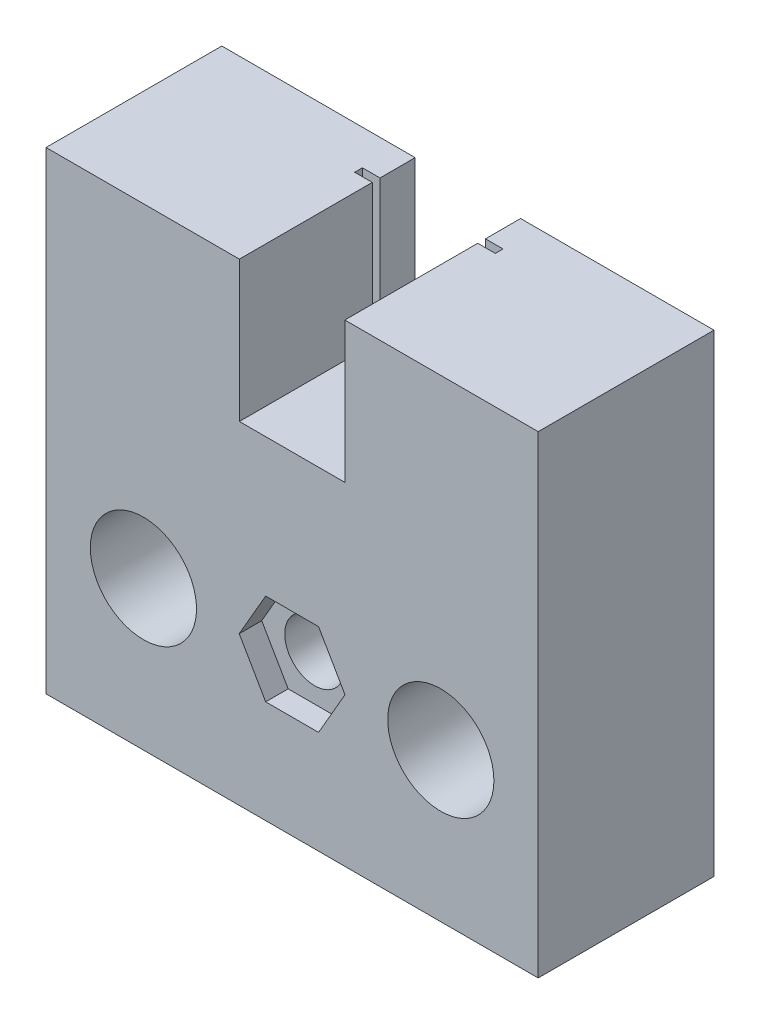
ISO-10303-21;
HEADER;
FILE_DESCRIPTION(('STEP AP214'),'2;1');
FILE_NAME('part.step','',(''),(''),'','','');
FILE_SCHEMA(('AUTOMOTIVE_DESIGN { 1 0 10303 214 1 1 1 1 }'));
ENDSEC;
DATA;
#1=APPLICATION_CONTEXT('core data for automotive mechanical design processes');
#2=APPLICATION_PROTOCOL_DEFINITION('international standard','automotive_design',2000,#1);
#3=PRODUCT_CONTEXT('',#1,'mechanical');
#4=PRODUCT('Part','Part','',(#3));
#5=PRODUCT_RELATED_PRODUCT_CATEGORY('part','',(#4));
#6=PRODUCT_DEFINITION_FORMATION('','',#4);
#7=PRODUCT_DEFINITION_CONTEXT('part definition',#1,'design');
#8=PRODUCT_DEFINITION('design','',#6,#7);
#9=PRODUCT_DEFINITION_SHAPE('','',#8);
#10=(LENGTH_UNIT() NAMED_UNIT(*) SI_UNIT(.MILLI.,.METRE.));
#11=(NAMED_UNIT(*) PLANE_ANGLE_UNIT() SI_UNIT($,.RADIAN.));
#12=(NAMED_UNIT(*) SI_UNIT($,.STERADIAN.) SOLID_ANGLE_UNIT());
#13=UNCERTAINTY_MEASURE_WITH_UNIT(LENGTH_MEASURE(1.E-05),#10,'distance_accuracy_value','');
#14=(GEOMETRIC_REPRESENTATION_CONTEXT(3) GLOBAL_UNCERTAINTY_ASSIGNED_CONTEXT((#13)) GLOBAL_UNIT_ASSIGNED_CONTEXT((#10,
#11,#12)) REPRESENTATION_CONTEXT('',''));
#15=CARTESIAN_POINT('',(0.,0.,0.));
#16=DIRECTION('',(0.,0.,1.));
#17=DIRECTION('',(1.,0.,0.));
#18=AXIS2_PLACEMENT_3D('',#15,#16,#17);
#19=CARTESIAN_POINT('',(-3.84331797235023,42.2534562211981,25.));
#20=DIRECTION('',(0.,-1.,0.));
#21=DIRECTION('',(0.,0.,-1.));
#22=AXIS2_PLACEMENT_3D('',#19,#20,#21);
#23=PLANE('',#22);
#24=DIRECTION('',(-1.,0.,0.));
#25=VECTOR('',#24,1.);
#26=CARTESIAN_POINT('',(-3.84331797235023,42.2534562211981,0.));
#27=LINE('',#26,#25);
#28=CARTESIAN_POINT('',(31.1566820276498,42.2534562211981,0.));
#29=VERTEX_POINT('',#28);
#30=CARTESIAN_POINT('',(3.65668202764977,42.2534562211981,0.));
#31=VERTEX_POINT('',#30);
#32=EDGE_CURVE('E385',#29,#31,#27,.T.);
#33=ORIENTED_EDGE('',*,*,#32,.T.);
#34=DIRECTION('',(0.,0.,-1.));
#35=VECTOR('',#34,1.);
#36=CARTESIAN_POINT('',(3.65668202764977,42.2534562211981,0.));
#37=LINE('',#36,#35);
#38=CARTESIAN_POINT('',(3.65668202764977,42.2534562211981,5.));
#39=VERTEX_POINT('',#38);
#40=EDGE_CURVE('E243',#39,#31,#37,.T.);
#41=ORIENTED_EDGE('',*,*,#40,.F.);
#42=DIRECTION('',(-1.,0.,0.));
#43=VECTOR('',#42,1.);
#44=CARTESIAN_POINT('',(3.65668202764977,42.2534562211981,5.));
#45=LINE('',#44,#43);
#46=CARTESIAN_POINT('',(6.15668202764977,42.2534562211981,5.));
#47=VERTEX_POINT('',#46);
#48=EDGE_CURVE('E450',#47,#39,#45,.T.);
#49=ORIENTED_EDGE('',*,*,#48,.F.);
#50=DIRECTION('',(0.,0.,-1.));
#51=VECTOR('',#50,1.);
#52=CARTESIAN_POINT('',(6.15668202764977,42.2534562211981,5.));
#53=LINE('',#52,#51);
#54=CARTESIAN_POINT('',(6.15668202764977,42.2534562211981,6.1));
#55=VERTEX_POINT('',#54);
#56=EDGE_CURVE('E447',#55,#47,#53,.T.);
#57=ORIENTED_EDGE('',*,*,#56,.F.);
#58=DIRECTION('',(1.,0.,0.));
#59=VECTOR('',#58,1.);
#60=CARTESIAN_POINT('',(6.15668202764977,42.2534562211981,6.1));
#61=LINE('',#60,#59);
#62=CARTESIAN_POINT('',(3.65668202764977,42.2534562211981,6.1));
#63=VERTEX_POINT('',#62);
#64=EDGE_CURVE('E444',#63,#55,#61,.T.);
#65=ORIENTED_EDGE('',*,*,#64,.F.);
#66=DIRECTION('',(0.,0.,-1.));
#67=VECTOR('',#66,1.);
#68=CARTESIAN_POINT('',(3.65668202764977,42.2534562211981,6.1));
#69=LINE('',#68,#67);
#70=CARTESIAN_POINT('',(3.65668202764978,42.2534562211981,25.));
#71=VERTEX_POINT('',#70);
#72=EDGE_CURVE('E413',#71,#63,#69,.T.);
#73=ORIENTED_EDGE('',*,*,#72,.F.);
#74=DIRECTION('',(-1.,0.,0.));
#75=VECTOR('',#74,1.);
#76=CARTESIAN_POINT('',(-3.84331797235023,42.2534562211981,25.));
#77=LINE('',#76,#75);
#78=CARTESIAN_POINT('',(31.1566820276498,42.2534562211981,25.));
#79=VERTEX_POINT('',#78);
#80=EDGE_CURVE('E367',#79,#71,#77,.T.);
#81=ORIENTED_EDGE('',*,*,#80,.F.);
#82=DIRECTION('',(0.,0.,-1.));
#83=VECTOR('',#82,1.);
#84=CARTESIAN_POINT('',(31.1566820276498,42.2534562211981,25.));
#85=LINE('',#84,#83);
#86=EDGE_CURVE('E378',#79,#29,#85,.T.);
#87=ORIENTED_EDGE('',*,*,#86,.T.);
#88=EDGE_LOOP('',(#33,#41,#49,#57,#65,#73,#81,#87));
#89=FACE_BOUND('',#88,.T.);
#90=ADVANCED_FACE('F40',(#89),#23,.F.);
#91=CARTESIAN_POINT('',(-38.8433179723502,42.2534562211981,25.));
#92=DIRECTION('',(1.,0.,0.));
#93=DIRECTION('',(0.,1.,0.));
#94=AXIS2_PLACEMENT_3D('',#91,#92,#93);
#95=PLANE('',#94);
#96=DIRECTION('',(0.,-1.,0.));
#97=VECTOR('',#96,1.);
#98=CARTESIAN_POINT('',(-38.8433179723502,42.2534562211981,0.));
#99=LINE('',#98,#97);
#100=CARTESIAN_POINT('',(-38.8433179723502,42.2534562211981,0.));
#101=VERTEX_POINT('',#100);
#102=CARTESIAN_POINT('',(-38.8433179723502,-25.0465437788018,0.));
#103=VERTEX_POINT('',#102);
#104=EDGE_CURVE('E356',#101,#103,#99,.T.);
#105=ORIENTED_EDGE('',*,*,#104,.T.);
#106=DIRECTION('',(0.,0.,-1.));
#107=VECTOR('',#106,1.);
#108=CARTESIAN_POINT('',(-38.8433179723502,-25.0465437788018,25.));
#109=LINE('',#108,#107);
#110=CARTESIAN_POINT('',(-38.8433179723502,-25.0465437788018,25.));
#111=VERTEX_POINT('',#110);
#112=EDGE_CURVE('E49',#111,#103,#109,.T.);
#113=ORIENTED_EDGE('',*,*,#112,.F.);
#114=DIRECTION('',(0.,-1.,0.));
#115=VECTOR('',#114,1.);
#116=CARTESIAN_POINT('',(-38.8433179723502,42.2534562211981,25.));
#117=LINE('',#116,#115);
#118=CARTESIAN_POINT('',(-38.8433179723502,42.2534562211981,25.));
#119=VERTEX_POINT('',#118);
#120=EDGE_CURVE('E370',#119,#111,#117,.T.);
#121=ORIENTED_EDGE('',*,*,#120,.F.);
#122=DIRECTION('',(0.,0.,-1.));
#123=VECTOR('',#122,1.);
#124=CARTESIAN_POINT('',(-38.8433179723502,42.2534562211981,25.));
#125=LINE('',#124,#123);
#126=EDGE_CURVE('E11',#119,#101,#125,.T.);
#127=ORIENTED_EDGE('',*,*,#126,.T.);
#128=EDGE_LOOP('',(#105,#113,#121,#127));
#129=FACE_BOUND('',#128,.T.);
#130=ADVANCED_FACE('F42',(#129),#95,.F.);
#131=CARTESIAN_POINT('',(31.1566820276498,-25.0465437788018,25.));
#132=DIRECTION('',(0.,1.,0.));
#133=DIRECTION('',(0.,0.,1.));
#134=AXIS2_PLACEMENT_3D('',#131,#132,#133);
#135=PLANE('',#134);
#136=DIRECTION('',(1.,0.,0.));
#137=VECTOR('',#136,1.);
#138=CARTESIAN_POINT('',(31.1566820276498,-25.0465437788018,0.));
#139=LINE('',#138,#137);
#140=CARTESIAN_POINT('',(31.1566820276498,-25.0465437788018,0.));
#141=VERTEX_POINT('',#140);
#142=EDGE_CURVE('E381',#103,#141,#139,.T.);
#143=ORIENTED_EDGE('',*,*,#142,.T.);
#144=DIRECTION('',(0.,0.,-1.));
#145=VECTOR('',#144,1.);
#146=CARTESIAN_POINT('',(31.1566820276498,-25.0465437788018,25.));
#147=LINE('',#146,#145);
#148=CARTESIAN_POINT('',(31.1566820276498,-25.0465437788018,25.));
#149=VERTEX_POINT('',#148);
#150=EDGE_CURVE('E390',#149,#141,#147,.T.);
#151=ORIENTED_EDGE('',*,*,#150,.F.);
#152=DIRECTION('',(1.,0.,0.));
#153=VECTOR('',#152,1.);
#154=CARTESIAN_POINT('',(-38.8433179723502,-25.0465437788018,25.));
#155=LINE('',#154,#153);
#156=EDGE_CURVE('E373',#111,#149,#155,.T.);
#157=ORIENTED_EDGE('',*,*,#156,.F.);
#158=ORIENTED_EDGE('',*,*,#112,.T.);
#159=EDGE_LOOP('',(#143,#151,#157,#158));
#160=FACE_BOUND('',#159,.T.);
#161=ADVANCED_FACE('F397',(#160),#135,.F.);
#162=CARTESIAN_POINT('',(31.1566820276498,42.2534562211981,25.));
#163=DIRECTION('',(-1.,0.,0.));
#164=DIRECTION('',(0.,-1.,0.));
#165=AXIS2_PLACEMENT_3D('',#162,#163,#164);
#166=PLANE('',#165);
#167=DIRECTION('',(0.,1.,0.));
#168=VECTOR('',#167,1.);
#169=CARTESIAN_POINT('',(31.1566820276498,42.2534562211981,0.));
#170=LINE('',#169,#168);
#171=EDGE_CURVE('E383',#141,#29,#170,.T.);
#172=ORIENTED_EDGE('',*,*,#171,.T.);
#173=ORIENTED_EDGE('',*,*,#86,.F.);
#174=DIRECTION('',(0.,1.,0.));
#175=VECTOR('',#174,1.);
#176=CARTESIAN_POINT('',(31.1566820276498,42.2534562211981,25.));
#177=LINE('',#176,#175);
#178=EDGE_CURVE('E375',#149,#79,#177,.T.);
#179=ORIENTED_EDGE('',*,*,#178,.F.);
#180=ORIENTED_EDGE('',*,*,#150,.T.);
#181=EDGE_LOOP('',(#172,#173,#179,#180));
#182=FACE_BOUND('',#181,.T.);
#183=ADVANCED_FACE('F406',(#182),#166,.F.);
#184=CARTESIAN_POINT('',(-11.3433179723502,42.2534562211981,25.));
#185=VERTEX_POINT('',#184);
#186=EDGE_CURVE('E371',#185,#119,#77,.T.);
#187=ORIENTED_EDGE('',*,*,#186,.F.);
#188=DIRECTION('',(0.,0.,1.));
#189=VECTOR('',#188,1.);
#190=CARTESIAN_POINT('',(-11.3433179723502,42.2534562211981,6.1));
#191=LINE('',#190,#189);
#192=CARTESIAN_POINT('',(-11.3433179723502,42.2534562211981,6.1));
#193=VERTEX_POINT('',#192);
#194=EDGE_CURVE('E426',#193,#185,#191,.T.);
#195=ORIENTED_EDGE('',*,*,#194,.F.);
#196=DIRECTION('',(1.,0.,0.));
#197=VECTOR('',#196,1.);
#198=CARTESIAN_POINT('',(-13.8433179723502,42.2534562211981,6.1));
#199=LINE('',#198,#197);
#200=CARTESIAN_POINT('',(-13.8433179723502,42.2534562211981,6.1));
#201=VERTEX_POINT('',#200);
#202=EDGE_CURVE('E439',#201,#193,#199,.T.);
#203=ORIENTED_EDGE('',*,*,#202,.F.);
#204=DIRECTION('',(0.,0.,1.));
#205=VECTOR('',#204,1.);
#206=CARTESIAN_POINT('',(-13.8433179723502,42.2534562211981,5.));
#207=LINE('',#206,#205);
#208=CARTESIAN_POINT('',(-13.8433179723502,42.2534562211981,5.));
#209=VERTEX_POINT('',#208);
#210=EDGE_CURVE('E433',#209,#201,#207,.T.);
#211=ORIENTED_EDGE('',*,*,#210,.F.);
#212=DIRECTION('',(-1.,0.,0.));
#213=VECTOR('',#212,1.);
#214=CARTESIAN_POINT('',(-11.3433179723502,42.2534562211981,5.));
#215=LINE('',#214,#213);
#216=CARTESIAN_POINT('',(-11.3433179723502,42.2534562211981,5.));
#217=VERTEX_POINT('',#216);
#218=EDGE_CURVE('E431',#217,#209,#215,.T.);
#219=ORIENTED_EDGE('',*,*,#218,.F.);
#220=DIRECTION('',(0.,0.,1.));
#221=VECTOR('',#220,1.);
#222=CARTESIAN_POINT('',(-11.3433179723502,42.2534562211981,0.));
#223=LINE('',#222,#221);
#224=CARTESIAN_POINT('',(-11.3433179723502,42.2534562211981,0.));
#225=VERTEX_POINT('',#224);
#226=EDGE_CURVE('E428',#225,#217,#223,.T.);
#227=ORIENTED_EDGE('',*,*,#226,.F.);
#228=EDGE_CURVE('E248',#225,#101,#27,.T.);
#229=ORIENTED_EDGE('',*,*,#228,.T.);
#230=ORIENTED_EDGE('',*,*,#126,.F.);
#231=EDGE_LOOP('',(#187,#195,#203,#211,#219,#227,#229,#230));
#232=FACE_BOUND('',#231,.T.);
#233=ADVANCED_FACE('F424',(#232),#23,.F.);
#234=CARTESIAN_POINT('',(0.,0.,25.));
#235=DIRECTION('',(0.,0.,1.));
#236=DIRECTION('',(1.,0.,0.));
#237=AXIS2_PLACEMENT_3D('',#234,#235,#236);
#238=PLANE('',#237);
#239=DIRECTION('',(0.,1.,0.));
#240=VECTOR('',#239,1.);
#241=CARTESIAN_POINT('',(3.65668202764978,22.2534562211982,25.));
#242=LINE('',#241,#240);
#243=CARTESIAN_POINT('',(3.65668202764978,22.2534562211982,25.));
#244=VERTEX_POINT('',#243);
#245=EDGE_CURVE('E463',#244,#71,#242,.T.);
#246=ORIENTED_EDGE('',*,*,#245,.F.);
#247=DIRECTION('',(1.,0.,0.));
#248=VECTOR('',#247,1.);
#249=CARTESIAN_POINT('',(3.65668202764978,22.2534562211982,25.));
#250=LINE('',#249,#248);
#251=CARTESIAN_POINT('',(-11.3433179723502,22.2534562211982,25.));
#252=VERTEX_POINT('',#251);
#253=EDGE_CURVE('E489',#252,#244,#250,.T.);
#254=ORIENTED_EDGE('',*,*,#253,.F.);
#255=DIRECTION('',(0.,1.,0.));
#256=VECTOR('',#255,1.);
#257=CARTESIAN_POINT('',(-11.3433179723502,22.2534562211982,25.));
#258=LINE('',#257,#256);
#259=EDGE_CURVE('E421',#252,#185,#258,.T.);
#260=ORIENTED_EDGE('',*,*,#259,.T.);
#261=ORIENTED_EDGE('',*,*,#186,.T.);
#262=ORIENTED_EDGE('',*,*,#120,.T.);
#263=ORIENTED_EDGE('',*,*,#156,.T.);
#264=ORIENTED_EDGE('',*,*,#178,.T.);
#265=ORIENTED_EDGE('',*,*,#80,.T.);
#266=EDGE_LOOP('',(#246,#254,#260,#261,#262,#263,#264,#265));
#267=FACE_BOUND('',#266,.T.);
#268=CARTESIAN_POINT('',(17.3066820276498,-3.89654377880185,25.));
#269=DIRECTION('',(0.,0.,1.));
#270=DIRECTION('',(1.,0.,0.));
#271=AXIS2_PLACEMENT_3D('',#268,#269,#270);
#272=CIRCLE('',#271,7.55);
#273=CARTESIAN_POINT('',(24.8566820276498,-3.89654377880185,25.));
#274=VERTEX_POINT('',#273);
#275=EDGE_CURVE('E259',#274,#274,#272,.T.);
#276=ORIENTED_EDGE('',*,*,#275,.F.);
#277=EDGE_LOOP('',(#276));
#278=FACE_BOUND('',#277,.T.);
#279=CARTESIAN_POINT('',(-24.9933179723502,-3.89654377880185,25.));
#280=DIRECTION('',(0.,0.,1.));
#281=DIRECTION('',(-1.,0.,0.));
#282=AXIS2_PLACEMENT_3D('',#279,#280,#281);
#283=CIRCLE('',#282,7.55);
#284=CARTESIAN_POINT('',(-32.5433179723502,-3.89654377880185,25.));
#285=VERTEX_POINT('',#284);
#286=EDGE_CURVE('E262',#285,#285,#283,.T.);
#287=ORIENTED_EDGE('',*,*,#286,.F.);
#288=EDGE_LOOP('',(#287));
#289=FACE_BOUND('',#288,.T.);
#290=DIRECTION('',(0.5,0.866025403784439,0.));
#291=VECTOR('',#290,1.);
#292=CARTESIAN_POINT('',(-0.08188096857981,-10.4115437788018,25.));
#293=LINE('',#292,#291);
#294=CARTESIAN_POINT('',(-0.08188096857981,-10.4115437788018,25.));
#295=VERTEX_POINT('',#294);
#296=CARTESIAN_POINT('',(3.6795560351906,-3.89654377880184,25.));
#297=VERTEX_POINT('',#296);
#298=EDGE_CURVE('E309',#295,#297,#293,.T.);
#299=ORIENTED_EDGE('',*,*,#298,.F.);
#300=DIRECTION('',(1.,0.,0.));
#301=VECTOR('',#300,1.);
#302=CARTESIAN_POINT('',(-7.60475497612064,-10.4115437788018,25.));
#303=LINE('',#302,#301);
#304=CARTESIAN_POINT('',(-7.60475497612064,-10.4115437788018,25.));
#305=VERTEX_POINT('',#304);
#306=EDGE_CURVE('E323',#305,#295,#303,.T.);
#307=ORIENTED_EDGE('',*,*,#306,.F.);
#308=DIRECTION('',(0.5,-0.866025403784439,0.));
#309=VECTOR('',#308,1.);
#310=CARTESIAN_POINT('',(-11.366191979891,-3.89654377880185,25.));
#311=LINE('',#310,#309);
#312=CARTESIAN_POINT('',(-11.366191979891,-3.89654377880185,25.));
#313=VERTEX_POINT('',#312);
#314=EDGE_CURVE('E349',#313,#305,#311,.T.);
#315=ORIENTED_EDGE('',*,*,#314,.F.);
#316=DIRECTION('',(-0.5,-0.866025403784439,0.));
#317=VECTOR('',#316,1.);
#318=CARTESIAN_POINT('',(-7.60475497612063,2.61845622119815,25.));
#319=LINE('',#318,#317);
#320=CARTESIAN_POINT('',(-7.60475497612063,2.61845622119815,25.));
#321=VERTEX_POINT('',#320);
#322=EDGE_CURVE('E346',#321,#313,#319,.T.);
#323=ORIENTED_EDGE('',*,*,#322,.F.);
#324=DIRECTION('',(-1.,0.,0.));
#325=VECTOR('',#324,1.);
#326=CARTESIAN_POINT('',(-0.0818809685798115,2.61845622119815,25.));
#327=LINE('',#326,#325);
#328=CARTESIAN_POINT('',(-0.0818809685798115,2.61845622119815,25.));
#329=VERTEX_POINT('',#328);
#330=EDGE_CURVE('E343',#329,#321,#327,.T.);
#331=ORIENTED_EDGE('',*,*,#330,.F.);
#332=DIRECTION('',(-0.5,0.866025403784439,0.));
#333=VECTOR('',#332,1.);
#334=CARTESIAN_POINT('',(3.6795560351906,-3.89654377880184,25.));
#335=LINE('',#334,#333);
#336=EDGE_CURVE('E340',#297,#329,#335,.T.);
#337=ORIENTED_EDGE('',*,*,#336,.F.);
#338=EDGE_LOOP('',(#299,#307,#315,#323,#331,#337));
#339=FACE_BOUND('',#338,.T.);
#340=ADVANCED_FACE('F416',(#267,#278,#289,#339),#238,.T.);
#341=CARTESIAN_POINT('',(0.,0.,0.));
#342=DIRECTION('',(0.,0.,1.));
#343=DIRECTION('',(1.,0.,0.));
#344=AXIS2_PLACEMENT_3D('',#341,#342,#343);
#345=PLANE('',#344);
#346=CARTESIAN_POINT('',(17.3066820276498,-3.89654377880185,0.));
#347=DIRECTION('',(0.,0.,1.));
#348=DIRECTION('',(1.,0.,0.));
#349=AXIS2_PLACEMENT_3D('',#346,#347,#348);
#350=CIRCLE('',#349,7.55);
#351=CARTESIAN_POINT('',(24.8566820276498,-3.89654377880185,0.));
#352=VERTEX_POINT('',#351);
#353=EDGE_CURVE('E256',#352,#352,#350,.T.);
#354=ORIENTED_EDGE('',*,*,#353,.T.);
#355=EDGE_LOOP('',(#354));
#356=FACE_BOUND('',#355,.T.);
#357=CARTESIAN_POINT('',(-24.9933179723502,-3.89654377880185,0.));
#358=DIRECTION('',(0.,0.,1.));
#359=DIRECTION('',(-1.,0.,0.));
#360=AXIS2_PLACEMENT_3D('',#357,#358,#359);
#361=CIRCLE('',#360,7.55);
#362=CARTESIAN_POINT('',(-32.5433179723502,-3.89654377880185,0.));
#363=VERTEX_POINT('',#362);
#364=EDGE_CURVE('E265',#363,#363,#361,.T.);
#365=ORIENTED_EDGE('',*,*,#364,.T.);
#366=EDGE_LOOP('',(#365));
#367=FACE_BOUND('',#366,.T.);
#368=DIRECTION('',(0.5,0.866025403784438,0.));
#369=VECTOR('',#368,1.);
#370=CARTESIAN_POINT('',(-11.366191979891,-3.89654377880184,0.));
#371=LINE('',#370,#369);
#372=CARTESIAN_POINT('',(-11.366191979891,-3.89654377880184,0.));
#373=VERTEX_POINT('',#372);
#374=CARTESIAN_POINT('',(-7.60475497612063,2.61845622119816,0.));
#375=VERTEX_POINT('',#374);
#376=EDGE_CURVE('E293',#373,#375,#371,.T.);
#377=ORIENTED_EDGE('',*,*,#376,.F.);
#378=DIRECTION('',(-0.5,0.866025403784439,0.));
#379=VECTOR('',#378,1.);
#380=CARTESIAN_POINT('',(-7.60475497612064,-10.4115437788018,0.));
#381=LINE('',#380,#379);
#382=CARTESIAN_POINT('',(-7.60475497612064,-10.4115437788018,0.));
#383=VERTEX_POINT('',#382);
#384=EDGE_CURVE('E64',#383,#373,#381,.T.);
#385=ORIENTED_EDGE('',*,*,#384,.F.);
#386=DIRECTION('',(-1.,0.,0.));
#387=VECTOR('',#386,1.);
#388=CARTESIAN_POINT('',(-0.0818809685798113,-10.4115437788018,0.));
#389=LINE('',#388,#387);
#390=CARTESIAN_POINT('',(-0.0818809685798113,-10.4115437788018,0.));
#391=VERTEX_POINT('',#390);
#392=EDGE_CURVE('E276',#391,#383,#389,.T.);
#393=ORIENTED_EDGE('',*,*,#392,.F.);
#394=DIRECTION('',(-0.5,-0.866025403784439,0.));
#395=VECTOR('',#394,1.);
#396=CARTESIAN_POINT('',(3.6795560351906,-3.89654377880185,0.));
#397=LINE('',#396,#395);
#398=CARTESIAN_POINT('',(3.6795560351906,-3.89654377880185,0.));
#399=VERTEX_POINT('',#398);
#400=EDGE_CURVE('E302',#399,#391,#397,.T.);
#401=ORIENTED_EDGE('',*,*,#400,.F.);
#402=DIRECTION('',(0.5,-0.866025403784439,0.));
#403=VECTOR('',#402,1.);
#404=CARTESIAN_POINT('',(-0.0818809685798122,2.61845622119816,0.));
#405=LINE('',#404,#403);
#406=CARTESIAN_POINT('',(-0.0818809685798122,2.61845622119816,0.));
#407=VERTEX_POINT('',#406);
#408=EDGE_CURVE('E299',#407,#399,#405,.T.);
#409=ORIENTED_EDGE('',*,*,#408,.F.);
#410=DIRECTION('',(1.,0.,0.));
#411=VECTOR('',#410,1.);
#412=CARTESIAN_POINT('',(-7.60475497612063,2.61845622119816,0.));
#413=LINE('',#412,#411);
#414=EDGE_CURVE('E296',#375,#407,#413,.T.);
#415=ORIENTED_EDGE('',*,*,#414,.F.);
#416=EDGE_LOOP('',(#377,#385,#393,#401,#409,#415));
#417=FACE_BOUND('',#416,.T.);
#418=DIRECTION('',(-1.,0.,0.));
#419=VECTOR('',#418,1.);
#420=CARTESIAN_POINT('',(-3.84331797235023,22.2534562211982,0.));
#421=LINE('',#420,#419);
#422=CARTESIAN_POINT('',(3.65668202764977,22.2534562211982,0.));
#423=VERTEX_POINT('',#422);
#424=CARTESIAN_POINT('',(-11.3433179723502,22.2534562211982,0.));
#425=VERTEX_POINT('',#424);
#426=EDGE_CURVE('E237',#423,#425,#421,.T.);
#427=ORIENTED_EDGE('',*,*,#426,.F.);
#428=DIRECTION('',(0.,1.,0.));
#429=VECTOR('',#428,1.);
#430=CARTESIAN_POINT('',(3.65668202764977,22.2534562211982,0.));
#431=LINE('',#430,#429);
#432=EDGE_CURVE('E268',#423,#31,#431,.T.);
#433=ORIENTED_EDGE('',*,*,#432,.T.);
#434=ORIENTED_EDGE('',*,*,#32,.F.);
#435=ORIENTED_EDGE('',*,*,#171,.F.);
#436=ORIENTED_EDGE('',*,*,#142,.F.);
#437=ORIENTED_EDGE('',*,*,#104,.F.);
#438=ORIENTED_EDGE('',*,*,#228,.F.);
#439=DIRECTION('',(0.,1.,0.));
#440=VECTOR('',#439,1.);
#441=CARTESIAN_POINT('',(-11.3433179723502,22.2534562211982,0.));
#442=LINE('',#441,#440);
#443=EDGE_CURVE('E231',#425,#225,#442,.T.);
#444=ORIENTED_EDGE('',*,*,#443,.F.);
#445=EDGE_LOOP('',(#427,#433,#434,#435,#436,#437,#438,#444));
#446=FACE_BOUND('',#445,.T.);
#447=ADVANCED_FACE('F246',(#356,#367,#417,#446),#345,.F.);
#448=CARTESIAN_POINT('',(-0.08188096857981,-10.4115437788018,21.8));
#449=DIRECTION('',(0.866025403784439,-0.5,0.));
#450=DIRECTION('',(0.5,0.866025403784439,0.));
#451=AXIS2_PLACEMENT_3D('',#448,#449,#450);
#452=PLANE('',#451);
#453=ORIENTED_EDGE('',*,*,#298,.T.);
#454=DIRECTION('',(0.,0.,1.));
#455=VECTOR('',#454,1.);
#456=CARTESIAN_POINT('',(3.6795560351906,-3.89654377880184,21.8));
#457=LINE('',#456,#455);
#458=CARTESIAN_POINT('',(3.6795560351906,-3.89654377880184,21.8));
#459=VERTEX_POINT('',#458);
#460=EDGE_CURVE('E338',#459,#297,#457,.T.);
#461=ORIENTED_EDGE('',*,*,#460,.F.);
#462=DIRECTION('',(0.5,0.866025403784439,0.));
#463=VECTOR('',#462,1.);
#464=CARTESIAN_POINT('',(-0.08188096857981,-10.4115437788018,21.8));
#465=LINE('',#464,#463);
#466=CARTESIAN_POINT('',(-0.08188096857981,-10.4115437788018,21.8));
#467=VERTEX_POINT('',#466);
#468=EDGE_CURVE('E319',#467,#459,#465,.T.);
#469=ORIENTED_EDGE('',*,*,#468,.F.);
#470=DIRECTION('',(0.,0.,1.));
#471=VECTOR('',#470,1.);
#472=CARTESIAN_POINT('',(-0.08188096857981,-10.4115437788018,21.8));
#473=LINE('',#472,#471);
#474=EDGE_CURVE('E354',#467,#295,#473,.T.);
#475=ORIENTED_EDGE('',*,*,#474,.T.);
#476=EDGE_LOOP('',(#453,#461,#469,#475));
#477=FACE_BOUND('',#476,.T.);
#478=ADVANCED_FACE('F586',(#477),#452,.F.);
#479=CARTESIAN_POINT('',(-7.60475497612064,-10.4115437788018,21.8));
#480=DIRECTION('',(0.,-1.,0.));
#481=DIRECTION('',(1.,0.,0.));
#482=AXIS2_PLACEMENT_3D('',#479,#480,#481);
#483=PLANE('',#482);
#484=ORIENTED_EDGE('',*,*,#306,.T.);
#485=ORIENTED_EDGE('',*,*,#474,.F.);
#486=DIRECTION('',(1.,0.,0.));
#487=VECTOR('',#486,1.);
#488=CARTESIAN_POINT('',(-7.60475497612064,-10.4115437788018,21.8));
#489=LINE('',#488,#487);
#490=CARTESIAN_POINT('',(-7.60475497612064,-10.4115437788018,21.8));
#491=VERTEX_POINT('',#490);
#492=EDGE_CURVE('E335',#491,#467,#489,.T.);
#493=ORIENTED_EDGE('',*,*,#492,.F.);
#494=DIRECTION('',(0.,0.,1.));
#495=VECTOR('',#494,1.);
#496=CARTESIAN_POINT('',(-7.60475497612064,-10.4115437788018,21.8));
#497=LINE('',#496,#495);
#498=EDGE_CURVE('E357',#491,#305,#497,.T.);
#499=ORIENTED_EDGE('',*,*,#498,.T.);
#500=EDGE_LOOP('',(#484,#485,#493,#499));
#501=FACE_BOUND('',#500,.T.);
#502=ADVANCED_FACE('F755',(#501),#483,.F.);
#503=CARTESIAN_POINT('',(-11.366191979891,-3.89654377880185,21.8));
#504=DIRECTION('',(-0.866025403784439,-0.5,0.));
#505=DIRECTION('',(0.5,-0.866025403784439,0.));
#506=AXIS2_PLACEMENT_3D('',#503,#504,#505);
#507=PLANE('',#506);
#508=ORIENTED_EDGE('',*,*,#314,.T.);
#509=ORIENTED_EDGE('',*,*,#498,.F.);
#510=DIRECTION('',(0.5,-0.866025403784439,0.));
#511=VECTOR('',#510,1.);
#512=CARTESIAN_POINT('',(-11.366191979891,-3.89654377880185,21.8));
#513=LINE('',#512,#511);
#514=CARTESIAN_POINT('',(-11.366191979891,-3.89654377880185,21.8));
#515=VERTEX_POINT('',#514);
#516=EDGE_CURVE('E332',#515,#491,#513,.T.);
#517=ORIENTED_EDGE('',*,*,#516,.F.);
#518=DIRECTION('',(0.,0.,1.));
#519=VECTOR('',#518,1.);
#520=CARTESIAN_POINT('',(-11.366191979891,-3.89654377880185,21.8));
#521=LINE('',#520,#519);
#522=EDGE_CURVE('E359',#515,#313,#521,.T.);
#523=ORIENTED_EDGE('',*,*,#522,.T.);
#524=EDGE_LOOP('',(#508,#509,#517,#523));
#525=FACE_BOUND('',#524,.T.);
#526=ADVANCED_FACE('F758',(#525),#507,.F.);
#527=CARTESIAN_POINT('',(-7.60475497612063,2.61845622119815,21.8));
#528=DIRECTION('',(-0.866025403784439,0.5,0.));
#529=DIRECTION('',(-0.5,-0.866025403784439,0.));
#530=AXIS2_PLACEMENT_3D('',#527,#528,#529);
#531=PLANE('',#530);
#532=ORIENTED_EDGE('',*,*,#322,.T.);
#533=ORIENTED_EDGE('',*,*,#522,.F.);
#534=DIRECTION('',(-0.5,-0.866025403784439,0.));
#535=VECTOR('',#534,1.);
#536=CARTESIAN_POINT('',(-7.60475497612063,2.61845622119815,21.8));
#537=LINE('',#536,#535);
#538=CARTESIAN_POINT('',(-7.60475497612063,2.61845622119815,21.8));
#539=VERTEX_POINT('',#538);
#540=EDGE_CURVE('E329',#539,#515,#537,.T.);
#541=ORIENTED_EDGE('',*,*,#540,.F.);
#542=DIRECTION('',(0.,0.,1.));
#543=VECTOR('',#542,1.);
#544=CARTESIAN_POINT('',(-7.60475497612063,2.61845622119815,21.8));
#545=LINE('',#544,#543);
#546=EDGE_CURVE('E361',#539,#321,#545,.T.);
#547=ORIENTED_EDGE('',*,*,#546,.T.);
#548=EDGE_LOOP('',(#532,#533,#541,#547));
#549=FACE_BOUND('',#548,.T.);
#550=ADVANCED_FACE('F762',(#549),#531,.F.);
#551=CARTESIAN_POINT('',(-0.0818809685798115,2.61845622119815,21.8));
#552=DIRECTION('',(0.,1.,0.));
#553=DIRECTION('',(0.,0.,1.));
#554=AXIS2_PLACEMENT_3D('',#551,#552,#553);
#555=PLANE('',#554);
#556=ORIENTED_EDGE('',*,*,#330,.T.);
#557=ORIENTED_EDGE('',*,*,#546,.F.);
#558=DIRECTION('',(-1.,0.,0.));
#559=VECTOR('',#558,1.);
#560=CARTESIAN_POINT('',(-0.0818809685798115,2.61845622119815,21.8));
#561=LINE('',#560,#559);
#562=CARTESIAN_POINT('',(-0.0818809685798115,2.61845622119815,21.8));
#563=VERTEX_POINT('',#562);
#564=EDGE_CURVE('E326',#563,#539,#561,.T.);
#565=ORIENTED_EDGE('',*,*,#564,.F.);
#566=DIRECTION('',(0.,0.,1.));
#567=VECTOR('',#566,1.);
#568=CARTESIAN_POINT('',(-0.0818809685798115,2.61845622119815,21.8));
#569=LINE('',#568,#567);
#570=EDGE_CURVE('E363',#563,#329,#569,.T.);
#571=ORIENTED_EDGE('',*,*,#570,.T.);
#572=EDGE_LOOP('',(#556,#557,#565,#571));
#573=FACE_BOUND('',#572,.T.);
#574=ADVANCED_FACE('F766',(#573),#555,.F.);
#575=CARTESIAN_POINT('',(3.6795560351906,-3.89654377880184,21.8));
#576=DIRECTION('',(0.866025403784439,0.5,0.));
#577=DIRECTION('',(-0.5,0.866025403784439,0.));
#578=AXIS2_PLACEMENT_3D('',#575,#576,#577);
#579=PLANE('',#578);
#580=ORIENTED_EDGE('',*,*,#336,.T.);
#581=ORIENTED_EDGE('',*,*,#570,.F.);
#582=DIRECTION('',(-0.5,0.866025403784439,0.));
#583=VECTOR('',#582,1.);
#584=CARTESIAN_POINT('',(3.6795560351906,-3.89654377880184,21.8));
#585=LINE('',#584,#583);
#586=EDGE_CURVE('E322',#459,#563,#585,.T.);
#587=ORIENTED_EDGE('',*,*,#586,.F.);
#588=ORIENTED_EDGE('',*,*,#460,.T.);
#589=EDGE_LOOP('',(#580,#581,#587,#588));
#590=FACE_BOUND('',#589,.T.);
#591=ADVANCED_FACE('F753',(#590),#579,.F.);
#592=CARTESIAN_POINT('',(0.,0.,21.8));
#593=DIRECTION('',(0.,0.,1.));
#594=DIRECTION('',(1.,0.,0.));
#595=AXIS2_PLACEMENT_3D('',#592,#593,#594);
#596=PLANE('',#595);
#597=CARTESIAN_POINT('',(-3.84331797235022,-3.89654377880185,21.8));
#598=DIRECTION('',(0.,0.,1.));
#599=DIRECTION('',(1.,0.,0.));
#600=AXIS2_PLACEMENT_3D('',#597,#598,#599);
#601=CIRCLE('',#600,4.25);
#602=CARTESIAN_POINT('',(0.406682027649778,-3.89654377880185,21.8));
#603=VERTEX_POINT('',#602);
#604=EDGE_CURVE('E269',#603,#603,#601,.T.);
#605=ORIENTED_EDGE('',*,*,#604,.F.);
#606=EDGE_LOOP('',(#605));
#607=FACE_BOUND('',#606,.T.);
#608=ORIENTED_EDGE('',*,*,#468,.T.);
#609=ORIENTED_EDGE('',*,*,#586,.T.);
#610=ORIENTED_EDGE('',*,*,#564,.T.);
#611=ORIENTED_EDGE('',*,*,#540,.T.);
#612=ORIENTED_EDGE('',*,*,#516,.T.);
#613=ORIENTED_EDGE('',*,*,#492,.T.);
#614=EDGE_LOOP('',(#608,#609,#610,#611,#612,#613));
#615=FACE_BOUND('',#614,.T.);
#616=ADVANCED_FACE('F750',(#607,#615),#596,.T.);
#617=CARTESIAN_POINT('',(-7.60475497612064,-10.4115437788018,3.2));
#618=DIRECTION('',(-0.866025403784439,-0.5,0.));
#619=DIRECTION('',(0.5,-0.866025403784439,0.));
#620=AXIS2_PLACEMENT_3D('',#617,#618,#619);
#621=PLANE('',#620);
#622=ORIENTED_EDGE('',*,*,#384,.T.);
#623=DIRECTION('',(0.,0.,-1.));
#624=VECTOR('',#623,1.);
#625=CARTESIAN_POINT('',(-11.366191979891,-3.89654377880184,3.2));
#626=LINE('',#625,#624);
#627=CARTESIAN_POINT('',(-11.366191979891,-3.89654377880184,3.2));
#628=VERTEX_POINT('',#627);
#629=EDGE_CURVE('E291',#628,#373,#626,.T.);
#630=ORIENTED_EDGE('',*,*,#629,.F.);
#631=DIRECTION('',(-0.5,0.866025403784439,0.));
#632=VECTOR('',#631,1.);
#633=CARTESIAN_POINT('',(-7.60475497612064,-10.4115437788018,3.2));
#634=LINE('',#633,#632);
#635=CARTESIAN_POINT('',(-7.60475497612064,-10.4115437788018,3.2));
#636=VERTEX_POINT('',#635);
#637=EDGE_CURVE('E272',#636,#628,#634,.T.);
#638=ORIENTED_EDGE('',*,*,#637,.F.);
#639=DIRECTION('',(0.,0.,-1.));
#640=VECTOR('',#639,1.);
#641=CARTESIAN_POINT('',(-7.60475497612064,-10.4115437788018,3.2));
#642=LINE('',#641,#640);
#643=EDGE_CURVE('E307',#636,#383,#642,.T.);
#644=ORIENTED_EDGE('',*,*,#643,.T.);
#645=EDGE_LOOP('',(#622,#630,#638,#644));
#646=FACE_BOUND('',#645,.T.);
#647=ADVANCED_FACE('F732',(#646),#621,.F.);
#648=CARTESIAN_POINT('',(-0.0818809685798113,-10.4115437788018,3.2));
#649=DIRECTION('',(0.,-1.,0.));
#650=DIRECTION('',(0.,0.,-1.));
#651=AXIS2_PLACEMENT_3D('',#648,#649,#650);
#652=PLANE('',#651);
#653=ORIENTED_EDGE('',*,*,#392,.T.);
#654=ORIENTED_EDGE('',*,*,#643,.F.);
#655=DIRECTION('',(-1.,0.,0.));
#656=VECTOR('',#655,1.);
#657=CARTESIAN_POINT('',(-0.0818809685798113,-10.4115437788018,3.2));
#658=LINE('',#657,#656);
#659=CARTESIAN_POINT('',(-0.0818809685798113,-10.4115437788018,3.2));
#660=VERTEX_POINT('',#659);
#661=EDGE_CURVE('E288',#660,#636,#658,.T.);
#662=ORIENTED_EDGE('',*,*,#661,.F.);
#663=DIRECTION('',(0.,0.,-1.));
#664=VECTOR('',#663,1.);
#665=CARTESIAN_POINT('',(-0.0818809685798113,-10.4115437788018,3.2));
#666=LINE('',#665,#664);
#667=EDGE_CURVE('E310',#660,#391,#666,.T.);
#668=ORIENTED_EDGE('',*,*,#667,.T.);
#669=EDGE_LOOP('',(#653,#654,#662,#668));
#670=FACE_BOUND('',#669,.T.);
#671=ADVANCED_FACE('F728',(#670),#652,.F.);
#672=CARTESIAN_POINT('',(3.6795560351906,-3.89654377880185,3.2));
#673=DIRECTION('',(0.866025403784439,-0.5,0.));
#674=DIRECTION('',(0.5,0.866025403784439,0.));
#675=AXIS2_PLACEMENT_3D('',#672,#673,#674);
#676=PLANE('',#675);
#677=ORIENTED_EDGE('',*,*,#400,.T.);
#678=ORIENTED_EDGE('',*,*,#667,.F.);
#679=DIRECTION('',(-0.5,-0.866025403784439,0.));
#680=VECTOR('',#679,1.);
#681=CARTESIAN_POINT('',(3.6795560351906,-3.89654377880185,3.2));
#682=LINE('',#681,#680);
#683=CARTESIAN_POINT('',(3.6795560351906,-3.89654377880185,3.2));
#684=VERTEX_POINT('',#683);
#685=EDGE_CURVE('E285',#684,#660,#682,.T.);
#686=ORIENTED_EDGE('',*,*,#685,.F.);
#687=DIRECTION('',(0.,0.,-1.));
#688=VECTOR('',#687,1.);
#689=CARTESIAN_POINT('',(3.6795560351906,-3.89654377880185,3.2));
#690=LINE('',#689,#688);
#691=EDGE_CURVE('E312',#684,#399,#690,.T.);
#692=ORIENTED_EDGE('',*,*,#691,.T.);
#693=EDGE_LOOP('',(#677,#678,#686,#692));
#694=FACE_BOUND('',#693,.T.);
#695=ADVANCED_FACE('F731',(#694),#676,.F.);
#696=CARTESIAN_POINT('',(-0.0818809685798122,2.61845622119816,3.2));
#697=DIRECTION('',(0.866025403784439,0.5,0.));
#698=DIRECTION('',(-0.5,0.866025403784439,0.));
#699=AXIS2_PLACEMENT_3D('',#696,#697,#698);
#700=PLANE('',#699);
#701=ORIENTED_EDGE('',*,*,#408,.T.);
#702=ORIENTED_EDGE('',*,*,#691,.F.);
#703=DIRECTION('',(0.5,-0.866025403784439,0.));
#704=VECTOR('',#703,1.);
#705=CARTESIAN_POINT('',(-0.0818809685798122,2.61845622119816,3.2));
#706=LINE('',#705,#704);
#707=CARTESIAN_POINT('',(-0.0818809685798122,2.61845622119816,3.2));
#708=VERTEX_POINT('',#707);
#709=EDGE_CURVE('E282',#708,#684,#706,.T.);
#710=ORIENTED_EDGE('',*,*,#709,.F.);
#711=DIRECTION('',(0.,0.,-1.));
#712=VECTOR('',#711,1.);
#713=CARTESIAN_POINT('',(-0.0818809685798122,2.61845622119816,3.2));
#714=LINE('',#713,#712);
#715=EDGE_CURVE('E314',#708,#407,#714,.T.);
#716=ORIENTED_EDGE('',*,*,#715,.T.);
#717=EDGE_LOOP('',(#701,#702,#710,#716));
#718=FACE_BOUND('',#717,.T.);
#719=ADVANCED_FACE('F736',(#718),#700,.F.);
#720=CARTESIAN_POINT('',(-7.60475497612063,2.61845622119816,3.2));
#721=DIRECTION('',(0.,1.,0.));
#722=DIRECTION('',(0.,0.,1.));
#723=AXIS2_PLACEMENT_3D('',#720,#721,#722);
#724=PLANE('',#723);
#725=ORIENTED_EDGE('',*,*,#414,.T.);
#726=ORIENTED_EDGE('',*,*,#715,.F.);
#727=DIRECTION('',(1.,0.,0.));
#728=VECTOR('',#727,1.);
#729=CARTESIAN_POINT('',(-7.60475497612063,2.61845622119816,3.2));
#730=LINE('',#729,#728);
#731=CARTESIAN_POINT('',(-7.60475497612063,2.61845622119816,3.2));
#732=VERTEX_POINT('',#731);
#733=EDGE_CURVE('E279',#732,#708,#730,.T.);
#734=ORIENTED_EDGE('',*,*,#733,.F.);
#735=DIRECTION('',(0.,0.,-1.));
#736=VECTOR('',#735,1.);
#737=CARTESIAN_POINT('',(-7.60475497612063,2.61845622119816,3.2));
#738=LINE('',#737,#736);
#739=EDGE_CURVE('E316',#732,#375,#738,.T.);
#740=ORIENTED_EDGE('',*,*,#739,.T.);
#741=EDGE_LOOP('',(#725,#726,#734,#740));
#742=FACE_BOUND('',#741,.T.);
#743=ADVANCED_FACE('F740',(#742),#724,.F.);
#744=CARTESIAN_POINT('',(-11.366191979891,-3.89654377880184,3.2));
#745=DIRECTION('',(-0.866025403784438,0.5,0.));
#746=DIRECTION('',(-0.5,-0.866025403784439,0.));
#747=AXIS2_PLACEMENT_3D('',#744,#745,#746);
#748=PLANE('',#747);
#749=ORIENTED_EDGE('',*,*,#376,.T.);
#750=ORIENTED_EDGE('',*,*,#739,.F.);
#751=DIRECTION('',(0.5,0.866025403784438,0.));
#752=VECTOR('',#751,1.);
#753=CARTESIAN_POINT('',(-11.366191979891,-3.89654377880184,3.2));
#754=LINE('',#753,#752);
#755=EDGE_CURVE('E275',#628,#732,#754,.T.);
#756=ORIENTED_EDGE('',*,*,#755,.F.);
#757=ORIENTED_EDGE('',*,*,#629,.T.);
#758=EDGE_LOOP('',(#749,#750,#756,#757));
#759=FACE_BOUND('',#758,.T.);
#760=ADVANCED_FACE('F726',(#759),#748,.F.);
#761=CARTESIAN_POINT('',(0.,0.,3.2));
#762=DIRECTION('',(0.,0.,-1.));
#763=DIRECTION('',(-1.,0.,0.));
#764=AXIS2_PLACEMENT_3D('',#761,#762,#763);
#765=PLANE('',#764);
#766=CARTESIAN_POINT('',(-3.84331797235022,-3.89654377880185,3.2));
#767=DIRECTION('',(0.,0.,-1.));
#768=DIRECTION('',(-1.,0.,0.));
#769=AXIS2_PLACEMENT_3D('',#766,#767,#768);
#770=CIRCLE('',#769,4.25);
#771=CARTESIAN_POINT('',(-8.09331797235022,-3.89654377880185,3.2));
#772=VERTEX_POINT('',#771);
#773=EDGE_CURVE('E44',#772,#772,#770,.T.);
#774=ORIENTED_EDGE('',*,*,#773,.F.);
#775=EDGE_LOOP('',(#774));
#776=FACE_BOUND('',#775,.T.);
#777=ORIENTED_EDGE('',*,*,#637,.T.);
#778=ORIENTED_EDGE('',*,*,#755,.T.);
#779=ORIENTED_EDGE('',*,*,#733,.T.);
#780=ORIENTED_EDGE('',*,*,#709,.T.);
#781=ORIENTED_EDGE('',*,*,#685,.T.);
#782=ORIENTED_EDGE('',*,*,#661,.T.);
#783=EDGE_LOOP('',(#777,#778,#779,#780,#781,#782));
#784=FACE_BOUND('',#783,.T.);
#785=ADVANCED_FACE('F722',(#776,#784),#765,.T.);
#786=CARTESIAN_POINT('',(-3.84331797235022,-3.89654377880185,0.));
#787=DIRECTION('',(0.,0.,1.));
#788=DIRECTION('',(1.,0.,0.));
#789=AXIS2_PLACEMENT_3D('',#786,#787,#788);
#790=CYLINDRICAL_SURFACE('',#789,4.25);
#791=ORIENTED_EDGE('',*,*,#604,.T.);
#792=EDGE_LOOP('',(#791));
#793=FACE_BOUND('',#792,.T.);
#794=ORIENTED_EDGE('',*,*,#773,.T.);
#795=EDGE_LOOP('',(#794));
#796=FACE_BOUND('',#795,.T.);
#797=ADVANCED_FACE('F718',(#793,#796),#790,.F.);
#798=CARTESIAN_POINT('',(-24.9933179723502,-3.89654377880185,0.));
#799=DIRECTION('',(0.,0.,1.));
#800=DIRECTION('',(1.,0.,0.));
#801=AXIS2_PLACEMENT_3D('',#798,#799,#800);
#802=CYLINDRICAL_SURFACE('',#801,7.55);
#803=ORIENTED_EDGE('',*,*,#364,.F.);
#804=EDGE_LOOP('',(#803));
#805=FACE_BOUND('',#804,.T.);
#806=ORIENTED_EDGE('',*,*,#286,.T.);
#807=EDGE_LOOP('',(#806));
#808=FACE_BOUND('',#807,.T.);
#809=ADVANCED_FACE('F714',(#805,#808),#802,.F.);
#810=CARTESIAN_POINT('',(17.3066820276498,-3.89654377880185,0.));
#811=DIRECTION('',(0.,0.,1.));
#812=DIRECTION('',(1.,0.,0.));
#813=AXIS2_PLACEMENT_3D('',#810,#811,#812);
#814=CYLINDRICAL_SURFACE('',#813,7.55);
#815=ORIENTED_EDGE('',*,*,#353,.F.);
#816=EDGE_LOOP('',(#815));
#817=FACE_BOUND('',#816,.T.);
#818=ORIENTED_EDGE('',*,*,#275,.T.);
#819=EDGE_LOOP('',(#818));
#820=FACE_BOUND('',#819,.T.);
#821=ADVANCED_FACE('F561',(#817,#820),#814,.F.);
#822=CARTESIAN_POINT('',(3.65668202764977,22.2534562211982,0.));
#823=DIRECTION('',(1.,0.,0.));
#824=DIRECTION('',(0.,0.,-1.));
#825=AXIS2_PLACEMENT_3D('',#822,#823,#824);
#826=PLANE('',#825);
#827=ORIENTED_EDGE('',*,*,#40,.T.);
#828=ORIENTED_EDGE('',*,*,#432,.F.);
#829=DIRECTION('',(0.,0.,-1.));
#830=VECTOR('',#829,1.);
#831=CARTESIAN_POINT('',(3.65668202764977,22.2534562211982,0.));
#832=LINE('',#831,#830);
#833=CARTESIAN_POINT('',(3.65668202764977,22.2534562211982,5.));
#834=VERTEX_POINT('',#833);
#835=EDGE_CURVE('E56',#834,#423,#832,.T.);
#836=ORIENTED_EDGE('',*,*,#835,.F.);
#837=DIRECTION('',(0.,1.,0.));
#838=VECTOR('',#837,1.);
#839=CARTESIAN_POINT('',(3.65668202764977,22.2534562211982,5.));
#840=LINE('',#839,#838);
#841=EDGE_CURVE('E455',#834,#39,#840,.T.);
#842=ORIENTED_EDGE('',*,*,#841,.T.);
#843=EDGE_LOOP('',(#827,#828,#836,#842));
#844=FACE_BOUND('',#843,.T.);
#845=ADVANCED_FACE('F506',(#844),#826,.F.);
#846=CARTESIAN_POINT('',(3.65668202764977,22.2534562211982,5.));
#847=DIRECTION('',(0.,0.,-1.));
#848=DIRECTION('',(-1.,0.,0.));
#849=AXIS2_PLACEMENT_3D('',#846,#847,#848);
#850=PLANE('',#849);
#851=ORIENTED_EDGE('',*,*,#48,.T.);
#852=ORIENTED_EDGE('',*,*,#841,.F.);
#853=DIRECTION('',(-1.,0.,0.));
#854=VECTOR('',#853,1.);
#855=CARTESIAN_POINT('',(3.65668202764977,22.2534562211982,5.));
#856=LINE('',#855,#854);
#857=CARTESIAN_POINT('',(6.15668202764977,22.2534562211982,5.));
#858=VERTEX_POINT('',#857);
#859=EDGE_CURVE('E252',#858,#834,#856,.T.);
#860=ORIENTED_EDGE('',*,*,#859,.F.);
#861=DIRECTION('',(0.,1.,0.));
#862=VECTOR('',#861,1.);
#863=CARTESIAN_POINT('',(6.15668202764977,22.2534562211982,5.));
#864=LINE('',#863,#862);
#865=EDGE_CURVE('E457',#858,#47,#864,.T.);
#866=ORIENTED_EDGE('',*,*,#865,.T.);
#867=EDGE_LOOP('',(#851,#852,#860,#866));
#868=FACE_BOUND('',#867,.T.);
#869=ADVANCED_FACE('F503',(#868),#850,.F.);
#870=CARTESIAN_POINT('',(6.15668202764977,22.2534562211982,5.));
#871=DIRECTION('',(1.,0.,0.));
#872=DIRECTION('',(0.,0.,-1.));
#873=AXIS2_PLACEMENT_3D('',#870,#871,#872);
#874=PLANE('',#873);
#875=ORIENTED_EDGE('',*,*,#56,.T.);
#876=ORIENTED_EDGE('',*,*,#865,.F.);
#877=DIRECTION('',(0.,0.,-1.));
#878=VECTOR('',#877,1.);
#879=CARTESIAN_POINT('',(6.15668202764977,22.2534562211982,5.));
#880=LINE('',#879,#878);
#881=CARTESIAN_POINT('',(6.15668202764977,22.2534562211982,6.1));
#882=VERTEX_POINT('',#881);
#883=EDGE_CURVE('E498',#882,#858,#880,.T.);
#884=ORIENTED_EDGE('',*,*,#883,.F.);
#885=DIRECTION('',(0.,1.,0.));
#886=VECTOR('',#885,1.);
#887=CARTESIAN_POINT('',(6.15668202764977,22.2534562211982,6.1));
#888=LINE('',#887,#886);
#889=EDGE_CURVE('E459',#882,#55,#888,.T.);
#890=ORIENTED_EDGE('',*,*,#889,.T.);
#891=EDGE_LOOP('',(#875,#876,#884,#890));
#892=FACE_BOUND('',#891,.T.);
#893=ADVANCED_FACE('F509',(#892),#874,.F.);
#894=CARTESIAN_POINT('',(6.15668202764977,22.2534562211982,6.1));
#895=DIRECTION('',(0.,0.,1.));
#896=DIRECTION('',(1.,0.,0.));
#897=AXIS2_PLACEMENT_3D('',#894,#895,#896);
#898=PLANE('',#897);
#899=ORIENTED_EDGE('',*,*,#64,.T.);
#900=ORIENTED_EDGE('',*,*,#889,.F.);
#901=DIRECTION('',(1.,0.,0.));
#902=VECTOR('',#901,1.);
#903=CARTESIAN_POINT('',(6.15668202764977,22.2534562211982,6.1));
#904=LINE('',#903,#902);
#905=CARTESIAN_POINT('',(3.65668202764977,22.2534562211982,6.1));
#906=VERTEX_POINT('',#905);
#907=EDGE_CURVE('E495',#906,#882,#904,.T.);
#908=ORIENTED_EDGE('',*,*,#907,.F.);
#909=DIRECTION('',(0.,1.,0.));
#910=VECTOR('',#909,1.);
#911=CARTESIAN_POINT('',(3.65668202764977,22.2534562211982,6.1));
#912=LINE('',#911,#910);
#913=EDGE_CURVE('E461',#906,#63,#912,.T.);
#914=ORIENTED_EDGE('',*,*,#913,.T.);
#915=EDGE_LOOP('',(#899,#900,#908,#914));
#916=FACE_BOUND('',#915,.T.);
#917=ADVANCED_FACE('F512',(#916),#898,.F.);
#918=CARTESIAN_POINT('',(3.65668202764977,22.2534562211982,6.1));
#919=DIRECTION('',(1.,0.,0.));
#920=DIRECTION('',(0.,0.,-1.));
#921=AXIS2_PLACEMENT_3D('',#918,#919,#920);
#922=PLANE('',#921);
#923=ORIENTED_EDGE('',*,*,#72,.T.);
#924=ORIENTED_EDGE('',*,*,#913,.F.);
#925=DIRECTION('',(0.,0.,-1.));
#926=VECTOR('',#925,1.);
#927=CARTESIAN_POINT('',(3.65668202764977,22.2534562211982,6.1));
#928=LINE('',#927,#926);
#929=EDGE_CURVE('E492',#244,#906,#928,.T.);
#930=ORIENTED_EDGE('',*,*,#929,.F.);
#931=ORIENTED_EDGE('',*,*,#245,.T.);
#932=EDGE_LOOP('',(#923,#924,#930,#931));
#933=FACE_BOUND('',#932,.T.);
#934=ADVANCED_FACE('F514',(#933),#922,.F.);
#935=CARTESIAN_POINT('',(-11.3433179723502,22.2534562211982,6.1));
#936=DIRECTION('',(-1.,0.,0.));
#937=DIRECTION('',(0.,0.,1.));
#938=AXIS2_PLACEMENT_3D('',#935,#936,#937);
#939=PLANE('',#938);
#940=ORIENTED_EDGE('',*,*,#194,.T.);
#941=ORIENTED_EDGE('',*,*,#259,.F.);
#942=DIRECTION('',(0.,0.,1.));
#943=VECTOR('',#942,1.);
#944=CARTESIAN_POINT('',(-11.3433179723502,22.2534562211982,6.1));
#945=LINE('',#944,#943);
#946=CARTESIAN_POINT('',(-11.3433179723502,22.2534562211982,6.1));
#947=VERTEX_POINT('',#946);
#948=EDGE_CURVE('E483',#947,#252,#945,.T.);
#949=ORIENTED_EDGE('',*,*,#948,.F.);
#950=DIRECTION('',(0.,1.,0.));
#951=VECTOR('',#950,1.);
#952=CARTESIAN_POINT('',(-11.3433179723502,22.2534562211982,6.1));
#953=LINE('',#952,#951);
#954=EDGE_CURVE('E466',#947,#193,#953,.T.);
#955=ORIENTED_EDGE('',*,*,#954,.T.);
#956=EDGE_LOOP('',(#940,#941,#949,#955));
#957=FACE_BOUND('',#956,.T.);
#958=ADVANCED_FACE('F516',(#957),#939,.F.);
#959=CARTESIAN_POINT('',(-13.8433179723502,22.2534562211982,6.1));
#960=DIRECTION('',(0.,0.,1.));
#961=DIRECTION('',(1.,0.,0.));
#962=AXIS2_PLACEMENT_3D('',#959,#960,#961);
#963=PLANE('',#962);
#964=ORIENTED_EDGE('',*,*,#202,.T.);
#965=ORIENTED_EDGE('',*,*,#954,.F.);
#966=DIRECTION('',(1.,0.,0.));
#967=VECTOR('',#966,1.);
#968=CARTESIAN_POINT('',(-13.8433179723502,22.2534562211982,6.1));
#969=LINE('',#968,#967);
#970=CARTESIAN_POINT('',(-13.8433179723502,22.2534562211982,6.1));
#971=VERTEX_POINT('',#970);
#972=EDGE_CURVE('E481',#971,#947,#969,.T.);
#973=ORIENTED_EDGE('',*,*,#972,.F.);
#974=DIRECTION('',(0.,1.,0.));
#975=VECTOR('',#974,1.);
#976=CARTESIAN_POINT('',(-13.8433179723502,22.2534562211982,6.1));
#977=LINE('',#976,#975);
#978=EDGE_CURVE('E468',#971,#201,#977,.T.);
#979=ORIENTED_EDGE('',*,*,#978,.T.);
#980=EDGE_LOOP('',(#964,#965,#973,#979));
#981=FACE_BOUND('',#980,.T.);
#982=ADVANCED_FACE('F477',(#981),#963,.F.);
#983=CARTESIAN_POINT('',(-13.8433179723502,22.2534562211982,5.));
#984=DIRECTION('',(-1.,0.,0.));
#985=DIRECTION('',(0.,0.,1.));
#986=AXIS2_PLACEMENT_3D('',#983,#984,#985);
#987=PLANE('',#986);
#988=ORIENTED_EDGE('',*,*,#210,.T.);
#989=ORIENTED_EDGE('',*,*,#978,.F.);
#990=DIRECTION('',(0.,0.,1.));
#991=VECTOR('',#990,1.);
#992=CARTESIAN_POINT('',(-13.8433179723502,22.2534562211982,5.));
#993=LINE('',#992,#991);
#994=CARTESIAN_POINT('',(-13.8433179723502,22.2534562211982,5.));
#995=VERTEX_POINT('',#994);
#996=EDGE_CURVE('E473',#995,#971,#993,.T.);
#997=ORIENTED_EDGE('',*,*,#996,.F.);
#998=DIRECTION('',(0.,1.,0.));
#999=VECTOR('',#998,1.);
#1000=CARTESIAN_POINT('',(-13.8433179723502,22.2534562211982,5.));
#1001=LINE('',#1000,#999);
#1002=EDGE_CURVE('E250',#995,#209,#1001,.T.);
#1003=ORIENTED_EDGE('',*,*,#1002,.T.);
#1004=EDGE_LOOP('',(#988,#989,#997,#1003));
#1005=FACE_BOUND('',#1004,.T.);
#1006=ADVANCED_FACE('F471',(#1005),#987,.F.);
#1007=CARTESIAN_POINT('',(-11.3433179723502,22.2534562211982,5.));
#1008=DIRECTION('',(0.,0.,-1.));
#1009=DIRECTION('',(-1.,0.,0.));
#1010=AXIS2_PLACEMENT_3D('',#1007,#1008,#1009);
#1011=PLANE('',#1010);
#1012=ORIENTED_EDGE('',*,*,#218,.T.);
#1013=ORIENTED_EDGE('',*,*,#1002,.F.);
#1014=DIRECTION('',(-1.,0.,0.));
#1015=VECTOR('',#1014,1.);
#1016=CARTESIAN_POINT('',(-11.3433179723502,22.2534562211982,5.));
#1017=LINE('',#1016,#1015);
#1018=CARTESIAN_POINT('',(-11.3433179723502,22.2534562211982,5.));
#1019=VERTEX_POINT('',#1018);
#1020=EDGE_CURVE('E236',#1019,#995,#1017,.T.);
#1021=ORIENTED_EDGE('',*,*,#1020,.F.);
#1022=DIRECTION('',(0.,1.,0.));
#1023=VECTOR('',#1022,1.);
#1024=CARTESIAN_POINT('',(-11.3433179723502,22.2534562211982,5.));
#1025=LINE('',#1024,#1023);
#1026=EDGE_CURVE('E233',#1019,#217,#1025,.T.);
#1027=ORIENTED_EDGE('',*,*,#1026,.T.);
#1028=EDGE_LOOP('',(#1012,#1013,#1021,#1027));
#1029=FACE_BOUND('',#1028,.T.);
#1030=ADVANCED_FACE('F475',(#1029),#1011,.F.);
#1031=CARTESIAN_POINT('',(-11.3433179723502,22.2534562211982,0.));
#1032=DIRECTION('',(-1.,0.,0.));
#1033=DIRECTION('',(0.,0.,1.));
#1034=AXIS2_PLACEMENT_3D('',#1031,#1032,#1033);
#1035=PLANE('',#1034);
#1036=ORIENTED_EDGE('',*,*,#226,.T.);
#1037=ORIENTED_EDGE('',*,*,#1026,.F.);
#1038=DIRECTION('',(0.,0.,1.));
#1039=VECTOR('',#1038,1.);
#1040=CARTESIAN_POINT('',(-11.3433179723502,22.2534562211982,0.));
#1041=LINE('',#1040,#1039);
#1042=EDGE_CURVE('E227',#425,#1019,#1041,.T.);
#1043=ORIENTED_EDGE('',*,*,#1042,.F.);
#1044=ORIENTED_EDGE('',*,*,#443,.T.);
#1045=EDGE_LOOP('',(#1036,#1037,#1043,#1044));
#1046=FACE_BOUND('',#1045,.T.);
#1047=ADVANCED_FACE('F229',(#1046),#1035,.F.);
#1048=CARTESIAN_POINT('',(0.,22.2534562211982,0.));
#1049=DIRECTION('',(0.,1.,0.));
#1050=DIRECTION('',(0.,0.,1.));
#1051=AXIS2_PLACEMENT_3D('',#1048,#1049,#1050);
#1052=PLANE('',#1051);
#1053=ORIENTED_EDGE('',*,*,#426,.T.);
#1054=ORIENTED_EDGE('',*,*,#1042,.T.);
#1055=ORIENTED_EDGE('',*,*,#1020,.T.);
#1056=ORIENTED_EDGE('',*,*,#996,.T.);
#1057=ORIENTED_EDGE('',*,*,#972,.T.);
#1058=ORIENTED_EDGE('',*,*,#948,.T.);
#1059=ORIENTED_EDGE('',*,*,#253,.T.);
#1060=ORIENTED_EDGE('',*,*,#929,.T.);
#1061=ORIENTED_EDGE('',*,*,#907,.T.);
#1062=ORIENTED_EDGE('',*,*,#883,.T.);
#1063=ORIENTED_EDGE('',*,*,#859,.T.);
#1064=ORIENTED_EDGE('',*,*,#835,.T.);
#1065=EDGE_LOOP('',(#1053,#1054,#1055,#1056,#1057,#1058,#1059,#1060,#1061,#1062,#1063,#1064));
#1066=FACE_BOUND('',#1065,.T.);
#1067=ADVANCED_FACE('F240',(#1066),#1052,.T.);
#1068=CLOSED_SHELL('',(#90,#130,#161,#183,#233,#340,#447,#478,#502,#526,#550,#574,#591,#616,
#647,#671,#695,#719,#743,#760,#785,#797,#809,#821,#845,#869,#893,#917,#934,#958,#982,#1006,
#1030,#1047,#1067));
#1069=MANIFOLD_SOLID_BREP('B2',#1068);
#1070=ADVANCED_BREP_SHAPE_REPRESENTATION('',(#18,#1069),#14);
#1071=SHAPE_DEFINITION_REPRESENTATION(#9,#1070);
ENDSEC;
END-ISO-10303-21;
